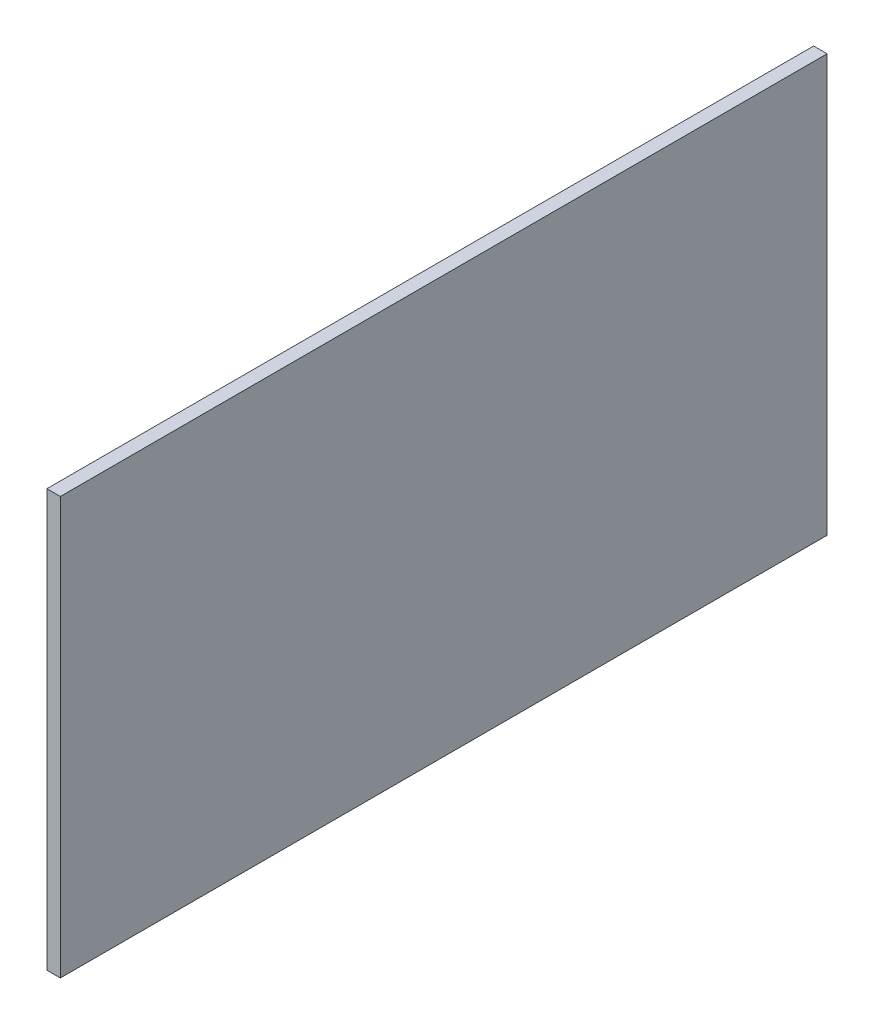
ISO-10303-21;
HEADER;
FILE_DESCRIPTION(('STEP AP214'),'2;1');
FILE_NAME('part.step','',(''),(''),'','','');
FILE_SCHEMA(('AUTOMOTIVE_DESIGN { 1 0 10303 214 1 1 1 1 }'));
ENDSEC;
DATA;
#1=APPLICATION_CONTEXT('core data for automotive mechanical design processes');
#2=APPLICATION_PROTOCOL_DEFINITION('international standard','automotive_design',2000,#1);
#3=PRODUCT_CONTEXT('',#1,'mechanical');
#4=PRODUCT('Part','Part','',(#3));
#5=PRODUCT_RELATED_PRODUCT_CATEGORY('part','',(#4));
#6=PRODUCT_DEFINITION_FORMATION('','',#4);
#7=PRODUCT_DEFINITION_CONTEXT('part definition',#1,'design');
#8=PRODUCT_DEFINITION('design','',#6,#7);
#9=PRODUCT_DEFINITION_SHAPE('','',#8);
#10=(LENGTH_UNIT() NAMED_UNIT(*) SI_UNIT(.MILLI.,.METRE.));
#11=(NAMED_UNIT(*) PLANE_ANGLE_UNIT() SI_UNIT($,.RADIAN.));
#12=(NAMED_UNIT(*) SI_UNIT($,.STERADIAN.) SOLID_ANGLE_UNIT());
#13=UNCERTAINTY_MEASURE_WITH_UNIT(LENGTH_MEASURE(1.E-05),#10,'distance_accuracy_value','');
#14=(GEOMETRIC_REPRESENTATION_CONTEXT(3) GLOBAL_UNCERTAINTY_ASSIGNED_CONTEXT((#13)) GLOBAL_UNIT_ASSIGNED_CONTEXT((#10,
#11,#12)) REPRESENTATION_CONTEXT('',''));
#15=CARTESIAN_POINT('',(0.,0.,0.));
#16=DIRECTION('',(0.,0.,1.));
#17=DIRECTION('',(1.,0.,0.));
#18=AXIS2_PLACEMENT_3D('',#15,#16,#17);
#19=CARTESIAN_POINT('',(25.,0.,0.));
#20=DIRECTION('',(0.,0.,-1.));
#21=DIRECTION('',(-1.,0.,0.));
#22=AXIS2_PLACEMENT_3D('',#19,#20,#21);
#23=PLANE('',#22);
#24=DIRECTION('',(0.,-1.,0.));
#25=VECTOR('',#24,1.);
#26=CARTESIAN_POINT('',(0.,0.,0.));
#27=LINE('',#26,#25);
#28=CARTESIAN_POINT('',(0.,775.,0.));
#29=VERTEX_POINT('',#28);
#30=CARTESIAN_POINT('',(0.,0.,0.));
#31=VERTEX_POINT('',#30);
#32=EDGE_CURVE('E96',#29,#31,#27,.T.);
#33=ORIENTED_EDGE('',*,*,#32,.T.);
#34=DIRECTION('',(-1.,0.,0.));
#35=VECTOR('',#34,1.);
#36=CARTESIAN_POINT('',(25.,0.,0.));
#37=LINE('',#36,#35);
#38=CARTESIAN_POINT('',(25.,0.,0.));
#39=VERTEX_POINT('',#38);
#40=EDGE_CURVE('E11',#39,#31,#37,.T.);
#41=ORIENTED_EDGE('',*,*,#40,.F.);
#42=DIRECTION('',(0.,-1.,0.));
#43=VECTOR('',#42,1.);
#44=CARTESIAN_POINT('',(25.,0.,0.));
#45=LINE('',#44,#43);
#46=CARTESIAN_POINT('',(25.,775.,0.));
#47=VERTEX_POINT('',#46);
#48=EDGE_CURVE('E84',#47,#39,#45,.T.);
#49=ORIENTED_EDGE('',*,*,#48,.F.);
#50=DIRECTION('',(-1.,0.,0.));
#51=VECTOR('',#50,1.);
#52=CARTESIAN_POINT('',(25.,775.,0.));
#53=LINE('',#52,#51);
#54=EDGE_CURVE('E92',#47,#29,#53,.T.);
#55=ORIENTED_EDGE('',*,*,#54,.T.);
#56=EDGE_LOOP('',(#33,#41,#49,#55));
#57=FACE_BOUND('',#56,.T.);
#58=ADVANCED_FACE('F33',(#57),#23,.F.);
#59=CARTESIAN_POINT('',(25.,0.,0.));
#60=DIRECTION('',(0.,1.,0.));
#61=DIRECTION('',(0.,0.,1.));
#62=AXIS2_PLACEMENT_3D('',#59,#60,#61);
#63=PLANE('',#62);
#64=DIRECTION('',(0.,0.,-1.));
#65=VECTOR('',#64,1.);
#66=CARTESIAN_POINT('',(0.,0.,0.));
#67=LINE('',#66,#65);
#68=CARTESIAN_POINT('',(0.,0.,-1425.));
#69=VERTEX_POINT('',#68);
#70=EDGE_CURVE('E88',#31,#69,#67,.T.);
#71=ORIENTED_EDGE('',*,*,#70,.T.);
#72=DIRECTION('',(-1.,0.,0.));
#73=VECTOR('',#72,1.);
#74=CARTESIAN_POINT('',(25.,0.,-1425.));
#75=LINE('',#74,#73);
#76=CARTESIAN_POINT('',(25.,0.,-1425.));
#77=VERTEX_POINT('',#76);
#78=EDGE_CURVE('E41',#77,#69,#75,.T.);
#79=ORIENTED_EDGE('',*,*,#78,.F.);
#80=DIRECTION('',(0.,0.,-1.));
#81=VECTOR('',#80,1.);
#82=CARTESIAN_POINT('',(25.,0.,0.));
#83=LINE('',#82,#81);
#84=EDGE_CURVE('E79',#39,#77,#83,.T.);
#85=ORIENTED_EDGE('',*,*,#84,.F.);
#86=ORIENTED_EDGE('',*,*,#40,.T.);
#87=EDGE_LOOP('',(#71,#79,#85,#86));
#88=FACE_BOUND('',#87,.T.);
#89=ADVANCED_FACE('F87',(#88),#63,.F.);
#90=CARTESIAN_POINT('',(25.,0.,-1425.));
#91=DIRECTION('',(0.,0.,1.));
#92=DIRECTION('',(1.,0.,0.));
#93=AXIS2_PLACEMENT_3D('',#90,#91,#92);
#94=PLANE('',#93);
#95=DIRECTION('',(0.,1.,0.));
#96=VECTOR('',#95,1.);
#97=CARTESIAN_POINT('',(0.,0.,-1425.));
#98=LINE('',#97,#96);
#99=CARTESIAN_POINT('',(0.,775.,-1425.));
#100=VERTEX_POINT('',#99);
#101=EDGE_CURVE('E66',#69,#100,#98,.T.);
#102=ORIENTED_EDGE('',*,*,#101,.T.);
#103=DIRECTION('',(-1.,0.,0.));
#104=VECTOR('',#103,1.);
#105=CARTESIAN_POINT('',(25.,775.,-1425.));
#106=LINE('',#105,#104);
#107=CARTESIAN_POINT('',(25.,775.,-1425.));
#108=VERTEX_POINT('',#107);
#109=EDGE_CURVE('E89',#108,#100,#106,.T.);
#110=ORIENTED_EDGE('',*,*,#109,.F.);
#111=DIRECTION('',(0.,1.,0.));
#112=VECTOR('',#111,1.);
#113=CARTESIAN_POINT('',(25.,0.,-1425.));
#114=LINE('',#113,#112);
#115=EDGE_CURVE('E82',#77,#108,#114,.T.);
#116=ORIENTED_EDGE('',*,*,#115,.F.);
#117=ORIENTED_EDGE('',*,*,#78,.T.);
#118=EDGE_LOOP('',(#102,#110,#116,#117));
#119=FACE_BOUND('',#118,.T.);
#120=ADVANCED_FACE('F90',(#119),#94,.F.);
#121=CARTESIAN_POINT('',(25.,775.,0.));
#122=DIRECTION('',(0.,-1.,0.));
#123=DIRECTION('',(0.,0.,-1.));
#124=AXIS2_PLACEMENT_3D('',#121,#122,#123);
#125=PLANE('',#124);
#126=DIRECTION('',(0.,0.,1.));
#127=VECTOR('',#126,1.);
#128=CARTESIAN_POINT('',(0.,775.,0.));
#129=LINE('',#128,#127);
#130=EDGE_CURVE('E72',#100,#29,#129,.T.);
#131=ORIENTED_EDGE('',*,*,#130,.T.);
#132=ORIENTED_EDGE('',*,*,#54,.F.);
#133=DIRECTION('',(0.,0.,1.));
#134=VECTOR('',#133,1.);
#135=CARTESIAN_POINT('',(25.,775.,0.));
#136=LINE('',#135,#134);
#137=EDGE_CURVE('E49',#108,#47,#136,.T.);
#138=ORIENTED_EDGE('',*,*,#137,.F.);
#139=ORIENTED_EDGE('',*,*,#109,.T.);
#140=EDGE_LOOP('',(#131,#132,#138,#139));
#141=FACE_BOUND('',#140,.T.);
#142=ADVANCED_FACE('F103',(#141),#125,.F.);
#143=CARTESIAN_POINT('',(25.,0.,0.));
#144=DIRECTION('',(-1.,0.,0.));
#145=DIRECTION('',(0.,0.,1.));
#146=AXIS2_PLACEMENT_3D('',#143,#144,#145);
#147=PLANE('',#146);
#148=ORIENTED_EDGE('',*,*,#48,.T.);
#149=ORIENTED_EDGE('',*,*,#84,.T.);
#150=ORIENTED_EDGE('',*,*,#115,.T.);
#151=ORIENTED_EDGE('',*,*,#137,.T.);
#152=EDGE_LOOP('',(#148,#149,#150,#151));
#153=FACE_BOUND('',#152,.T.);
#154=ADVANCED_FACE('F80',(#153),#147,.F.);
#155=CARTESIAN_POINT('',(0.,0.,0.));
#156=DIRECTION('',(-1.,0.,0.));
#157=DIRECTION('',(0.,0.,1.));
#158=AXIS2_PLACEMENT_3D('',#155,#156,#157);
#159=PLANE('',#158);
#160=ORIENTED_EDGE('',*,*,#32,.F.);
#161=ORIENTED_EDGE('',*,*,#130,.F.);
#162=ORIENTED_EDGE('',*,*,#101,.F.);
#163=ORIENTED_EDGE('',*,*,#70,.F.);
#164=EDGE_LOOP('',(#160,#161,#162,#163));
#165=FACE_BOUND('',#164,.T.);
#166=ADVANCED_FACE('F106',(#165),#159,.T.);
#167=CLOSED_SHELL('',(#58,#89,#120,#142,#154,#166));
#168=MANIFOLD_SOLID_BREP('B2',#167);
#169=ADVANCED_BREP_SHAPE_REPRESENTATION('',(#18,#168),#14);
#170=SHAPE_DEFINITION_REPRESENTATION(#9,#169);
ENDSEC;
END-ISO-10303-21;
